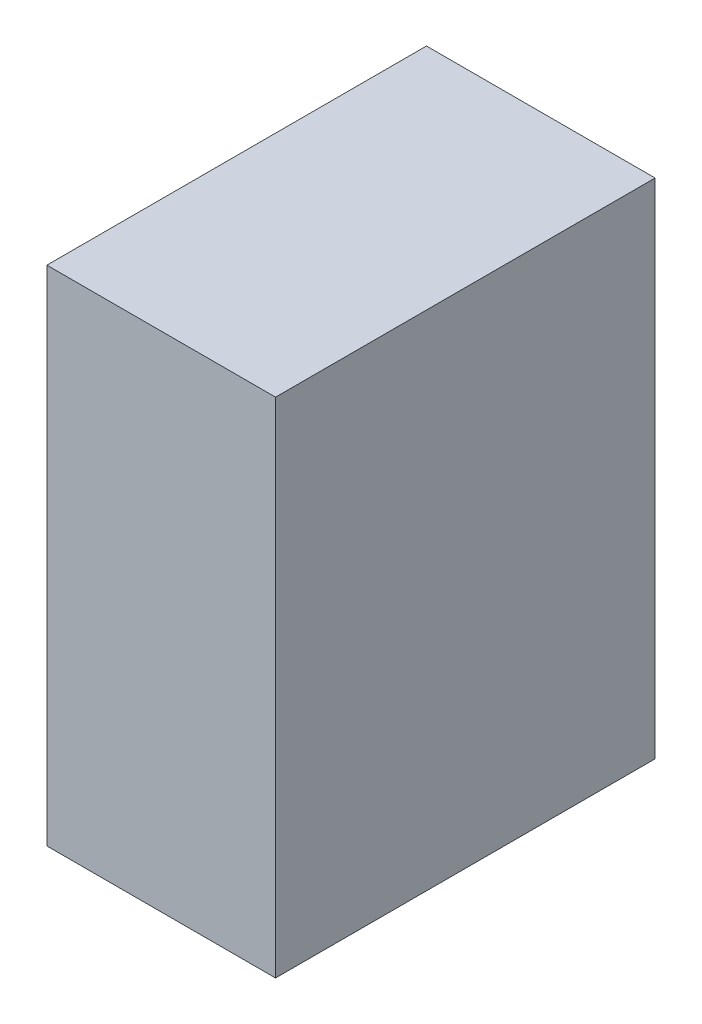
ISO-10303-21;
HEADER;
FILE_DESCRIPTION(('STEP AP214'),'2;1');
FILE_NAME('part.step','',(''),(''),'','','');
FILE_SCHEMA(('AUTOMOTIVE_DESIGN { 1 0 10303 214 1 1 1 1 }'));
ENDSEC;
DATA;
#1=APPLICATION_CONTEXT('core data for automotive mechanical design processes');
#2=APPLICATION_PROTOCOL_DEFINITION('international standard','automotive_design',2000,#1);
#3=PRODUCT_CONTEXT('',#1,'mechanical');
#4=PRODUCT('Part','Part','',(#3));
#5=PRODUCT_RELATED_PRODUCT_CATEGORY('part','',(#4));
#6=PRODUCT_DEFINITION_FORMATION('','',#4);
#7=PRODUCT_DEFINITION_CONTEXT('part definition',#1,'design');
#8=PRODUCT_DEFINITION('design','',#6,#7);
#9=PRODUCT_DEFINITION_SHAPE('','',#8);
#10=(LENGTH_UNIT() NAMED_UNIT(*) SI_UNIT(.MILLI.,.METRE.));
#11=(NAMED_UNIT(*) PLANE_ANGLE_UNIT() SI_UNIT($,.RADIAN.));
#12=(NAMED_UNIT(*) SI_UNIT($,.STERADIAN.) SOLID_ANGLE_UNIT());
#13=UNCERTAINTY_MEASURE_WITH_UNIT(LENGTH_MEASURE(1.E-05),#10,'distance_accuracy_value','');
#14=(GEOMETRIC_REPRESENTATION_CONTEXT(3) GLOBAL_UNCERTAINTY_ASSIGNED_CONTEXT((#13)) GLOBAL_UNIT_ASSIGNED_CONTEXT((#10,
#11,#12)) REPRESENTATION_CONTEXT('',''));
#15=CARTESIAN_POINT('',(0.,0.,0.));
#16=DIRECTION('',(0.,0.,1.));
#17=DIRECTION('',(1.,0.,0.));
#18=AXIS2_PLACEMENT_3D('',#15,#16,#17);
#19=CARTESIAN_POINT('',(-6.35,-12.7,21.082));
#20=DIRECTION('',(1.,0.,0.));
#21=DIRECTION('',(0.,0.,-1.));
#22=AXIS2_PLACEMENT_3D('',#19,#20,#21);
#23=PLANE('',#22);
#24=DIRECTION('',(0.,-1.,0.));
#25=VECTOR('',#24,1.);
#26=CARTESIAN_POINT('',(-6.35,-12.7,0.));
#27=LINE('',#26,#25);
#28=CARTESIAN_POINT('',(-6.35,15.24,0.));
#29=VERTEX_POINT('',#28);
#30=CARTESIAN_POINT('',(-6.35,-12.7,0.));
#31=VERTEX_POINT('',#30);
#32=EDGE_CURVE('E87',#29,#31,#27,.T.);
#33=ORIENTED_EDGE('',*,*,#32,.T.);
#34=DIRECTION('',(0.,0.,-1.));
#35=VECTOR('',#34,1.);
#36=CARTESIAN_POINT('',(-6.35,-12.7,21.082));
#37=LINE('',#36,#35);
#38=CARTESIAN_POINT('',(-6.35,-12.7,21.082));
#39=VERTEX_POINT('',#38);
#40=EDGE_CURVE('E47',#39,#31,#37,.T.);
#41=ORIENTED_EDGE('',*,*,#40,.F.);
#42=DIRECTION('',(0.,-1.,0.));
#43=VECTOR('',#42,1.);
#44=CARTESIAN_POINT('',(-6.35,-12.7,21.082));
#45=LINE('',#44,#43);
#46=CARTESIAN_POINT('',(-6.35,15.24,21.082));
#47=VERTEX_POINT('',#46);
#48=EDGE_CURVE('E105',#47,#39,#45,.T.);
#49=ORIENTED_EDGE('',*,*,#48,.F.);
#50=DIRECTION('',(0.,0.,1.));
#51=VECTOR('',#50,1.);
#52=CARTESIAN_POINT('',(-6.35,15.24,21.082));
#53=LINE('',#52,#51);
#54=EDGE_CURVE('E122',#29,#47,#53,.T.);
#55=ORIENTED_EDGE('',*,*,#54,.F.);
#56=EDGE_LOOP('',(#33,#41,#49,#55));
#57=FACE_BOUND('',#56,.T.);
#58=ADVANCED_FACE('F39',(#57),#23,.F.);
#59=CARTESIAN_POINT('',(6.35,-12.7,21.082));
#60=DIRECTION('',(0.,1.,0.));
#61=DIRECTION('',(-1.,0.,0.));
#62=AXIS2_PLACEMENT_3D('',#59,#60,#61);
#63=PLANE('',#62);
#64=DIRECTION('',(1.,0.,0.));
#65=VECTOR('',#64,1.);
#66=CARTESIAN_POINT('',(6.35,-12.7,0.));
#67=LINE('',#66,#65);
#68=CARTESIAN_POINT('',(-4.064,-12.7,0.));
#69=VERTEX_POINT('',#68);
#70=EDGE_CURVE('E86',#31,#69,#67,.T.);
#71=ORIENTED_EDGE('',*,*,#70,.T.);
#72=DIRECTION('',(0.,0.,1.));
#73=VECTOR('',#72,1.);
#74=CARTESIAN_POINT('',(-4.064,-12.7,21.082));
#75=LINE('',#74,#73);
#76=CARTESIAN_POINT('',(-4.064,-12.7,18.542));
#77=VERTEX_POINT('',#76);
#78=EDGE_CURVE('E137',#69,#77,#75,.T.);
#79=ORIENTED_EDGE('',*,*,#78,.T.);
#80=DIRECTION('',(1.,0.,0.));
#81=VECTOR('',#80,1.);
#82=CARTESIAN_POINT('',(6.35,-12.7,18.542));
#83=LINE('',#82,#81);
#84=CARTESIAN_POINT('',(4.064,-12.7,18.542));
#85=VERTEX_POINT('',#84);
#86=EDGE_CURVE('E127',#77,#85,#83,.T.);
#87=ORIENTED_EDGE('',*,*,#86,.T.);
#88=DIRECTION('',(0.,0.,-1.));
#89=VECTOR('',#88,1.);
#90=CARTESIAN_POINT('',(4.064,-12.7,21.082));
#91=LINE('',#90,#89);
#92=CARTESIAN_POINT('',(4.064,-12.7,5.33400000000001));
#93=VERTEX_POINT('',#92);
#94=EDGE_CURVE('E124',#85,#93,#91,.T.);
#95=ORIENTED_EDGE('',*,*,#94,.T.);
#96=DIRECTION('',(-1.,0.,0.));
#97=VECTOR('',#96,1.);
#98=CARTESIAN_POINT('',(6.35,-12.7,5.33400000000001));
#99=LINE('',#98,#97);
#100=CARTESIAN_POINT('',(1.016,-12.7,5.33400000000001));
#101=VERTEX_POINT('',#100);
#102=EDGE_CURVE('E140',#93,#101,#99,.T.);
#103=ORIENTED_EDGE('',*,*,#102,.T.);
#104=DIRECTION('',(0.,0.,-1.));
#105=VECTOR('',#104,1.);
#106=CARTESIAN_POINT('',(1.016,-12.7,21.082));
#107=LINE('',#106,#105);
#108=CARTESIAN_POINT('',(1.016,-12.7,0.));
#109=VERTEX_POINT('',#108);
#110=EDGE_CURVE('E54',#101,#109,#107,.T.);
#111=ORIENTED_EDGE('',*,*,#110,.T.);
#112=CARTESIAN_POINT('',(6.35,-12.7,0.));
#113=VERTEX_POINT('',#112);
#114=EDGE_CURVE('E74',#109,#113,#67,.T.);
#115=ORIENTED_EDGE('',*,*,#114,.T.);
#116=DIRECTION('',(0.,0.,-1.));
#117=VECTOR('',#116,1.);
#118=CARTESIAN_POINT('',(6.35,-12.7,21.082));
#119=LINE('',#118,#117);
#120=CARTESIAN_POINT('',(6.35,-12.7,21.082));
#121=VERTEX_POINT('',#120);
#122=EDGE_CURVE('E78',#121,#113,#119,.T.);
#123=ORIENTED_EDGE('',*,*,#122,.F.);
#124=DIRECTION('',(1.,0.,0.));
#125=VECTOR('',#124,1.);
#126=CARTESIAN_POINT('',(6.35,-12.7,21.082));
#127=LINE('',#126,#125);
#128=EDGE_CURVE('E62',#39,#121,#127,.T.);
#129=ORIENTED_EDGE('',*,*,#128,.F.);
#130=ORIENTED_EDGE('',*,*,#40,.T.);
#131=EDGE_LOOP('',(#71,#79,#87,#95,#103,#111,#115,#123,#129,#130));
#132=FACE_BOUND('',#131,.T.);
#133=ADVANCED_FACE('F77',(#132),#63,.F.);
#134=CARTESIAN_POINT('',(6.35,-12.7,21.082));
#135=DIRECTION('',(-1.,0.,0.));
#136=DIRECTION('',(0.,0.,1.));
#137=AXIS2_PLACEMENT_3D('',#134,#135,#136);
#138=PLANE('',#137);
#139=DIRECTION('',(0.,1.,0.));
#140=VECTOR('',#139,1.);
#141=CARTESIAN_POINT('',(6.35,-12.7,0.));
#142=LINE('',#141,#140);
#143=CARTESIAN_POINT('',(6.35,15.24,0.));
#144=VERTEX_POINT('',#143);
#145=EDGE_CURVE('E94',#113,#144,#142,.T.);
#146=ORIENTED_EDGE('',*,*,#145,.T.);
#147=DIRECTION('',(0.,0.,-1.));
#148=VECTOR('',#147,1.);
#149=CARTESIAN_POINT('',(6.35,15.24,21.082));
#150=LINE('',#149,#148);
#151=CARTESIAN_POINT('',(6.35,15.24,21.082));
#152=VERTEX_POINT('',#151);
#153=EDGE_CURVE('E189',#152,#144,#150,.T.);
#154=ORIENTED_EDGE('',*,*,#153,.F.);
#155=DIRECTION('',(0.,1.,0.));
#156=VECTOR('',#155,1.);
#157=CARTESIAN_POINT('',(6.35,-12.7,21.082));
#158=LINE('',#157,#156);
#159=EDGE_CURVE('E96',#121,#152,#158,.T.);
#160=ORIENTED_EDGE('',*,*,#159,.F.);
#161=ORIENTED_EDGE('',*,*,#122,.T.);
#162=EDGE_LOOP('',(#146,#154,#160,#161));
#163=FACE_BOUND('',#162,.T.);
#164=ADVANCED_FACE('F91',(#163),#138,.F.);
#165=CARTESIAN_POINT('',(0.,0.,21.082));
#166=DIRECTION('',(0.,0.,1.));
#167=DIRECTION('',(1.,0.,0.));
#168=AXIS2_PLACEMENT_3D('',#165,#166,#167);
#169=PLANE('',#168);
#170=ORIENTED_EDGE('',*,*,#48,.T.);
#171=ORIENTED_EDGE('',*,*,#128,.T.);
#172=ORIENTED_EDGE('',*,*,#159,.T.);
#173=DIRECTION('',(1.,0.,0.));
#174=VECTOR('',#173,1.);
#175=CARTESIAN_POINT('',(6.35,15.24,21.082));
#176=LINE('',#175,#174);
#177=EDGE_CURVE('E184',#47,#152,#176,.T.);
#178=ORIENTED_EDGE('',*,*,#177,.F.);
#179=EDGE_LOOP('',(#170,#171,#172,#178));
#180=FACE_BOUND('',#179,.T.);
#181=ADVANCED_FACE('F266',(#180),#169,.T.);
#182=CARTESIAN_POINT('',(0.,0.,0.));
#183=DIRECTION('',(0.,0.,1.));
#184=DIRECTION('',(1.,0.,0.));
#185=AXIS2_PLACEMENT_3D('',#182,#183,#184);
#186=PLANE('',#185);
#187=ORIENTED_EDGE('',*,*,#114,.F.);
#188=DIRECTION('',(0.,1.,0.));
#189=VECTOR('',#188,1.);
#190=CARTESIAN_POINT('',(1.01600000000001,-15.24,0.));
#191=LINE('',#190,#189);
#192=CARTESIAN_POINT('',(1.016,12.7,0.));
#193=VERTEX_POINT('',#192);
#194=EDGE_CURVE('E174',#109,#193,#191,.T.);
#195=ORIENTED_EDGE('',*,*,#194,.T.);
#196=DIRECTION('',(-1.,0.,0.));
#197=VECTOR('',#196,1.);
#198=CARTESIAN_POINT('',(6.35,12.7,0.));
#199=LINE('',#198,#197);
#200=CARTESIAN_POINT('',(-4.064,12.7,0.));
#201=VERTEX_POINT('',#200);
#202=EDGE_CURVE('E185',#193,#201,#199,.T.);
#203=ORIENTED_EDGE('',*,*,#202,.T.);
#204=DIRECTION('',(0.,1.,0.));
#205=VECTOR('',#204,1.);
#206=CARTESIAN_POINT('',(-4.064,-15.24,0.));
#207=LINE('',#206,#205);
#208=EDGE_CURVE('E173',#69,#201,#207,.T.);
#209=ORIENTED_EDGE('',*,*,#208,.F.);
#210=ORIENTED_EDGE('',*,*,#70,.F.);
#211=ORIENTED_EDGE('',*,*,#32,.F.);
#212=DIRECTION('',(-1.,0.,0.));
#213=VECTOR('',#212,1.);
#214=CARTESIAN_POINT('',(6.35,15.24,0.));
#215=LINE('',#214,#213);
#216=EDGE_CURVE('E102',#144,#29,#215,.T.);
#217=ORIENTED_EDGE('',*,*,#216,.F.);
#218=ORIENTED_EDGE('',*,*,#145,.F.);
#219=EDGE_LOOP('',(#187,#195,#203,#209,#210,#211,#217,#218));
#220=FACE_BOUND('',#219,.T.);
#221=ADVANCED_FACE('F99',(#220),#186,.F.);
#222=CARTESIAN_POINT('',(4.064,-15.24,18.542));
#223=DIRECTION('',(1.,0.,0.));
#224=DIRECTION('',(0.,1.,0.));
#225=AXIS2_PLACEMENT_3D('',#222,#223,#224);
#226=PLANE('',#225);
#227=DIRECTION('',(0.,1.,0.));
#228=VECTOR('',#227,1.);
#229=CARTESIAN_POINT('',(4.064,-15.24,18.542));
#230=LINE('',#229,#228);
#231=CARTESIAN_POINT('',(4.064,12.7,18.542));
#232=VERTEX_POINT('',#231);
#233=EDGE_CURVE('E143',#85,#232,#230,.T.);
#234=ORIENTED_EDGE('',*,*,#233,.T.);
#235=DIRECTION('',(0.,0.,-1.));
#236=VECTOR('',#235,1.);
#237=CARTESIAN_POINT('',(4.064,12.7,18.542));
#238=LINE('',#237,#236);
#239=CARTESIAN_POINT('',(4.064,12.7,5.33400000000001));
#240=VERTEX_POINT('',#239);
#241=EDGE_CURVE('E167',#232,#240,#238,.T.);
#242=ORIENTED_EDGE('',*,*,#241,.T.);
#243=DIRECTION('',(0.,1.,0.));
#244=VECTOR('',#243,1.);
#245=CARTESIAN_POINT('',(4.064,-15.24,5.33400000000001));
#246=LINE('',#245,#244);
#247=EDGE_CURVE('E144',#93,#240,#246,.T.);
#248=ORIENTED_EDGE('',*,*,#247,.F.);
#249=ORIENTED_EDGE('',*,*,#94,.F.);
#250=EDGE_LOOP('',(#234,#242,#248,#249));
#251=FACE_BOUND('',#250,.T.);
#252=ADVANCED_FACE('F238',(#251),#226,.F.);
#253=CARTESIAN_POINT('',(4.064,-15.24,18.542));
#254=DIRECTION('',(0.,0.,1.));
#255=DIRECTION('',(1.,0.,0.));
#256=AXIS2_PLACEMENT_3D('',#253,#254,#255);
#257=PLANE('',#256);
#258=DIRECTION('',(0.,1.,0.));
#259=VECTOR('',#258,1.);
#260=CARTESIAN_POINT('',(-4.064,-15.24,18.542));
#261=LINE('',#260,#259);
#262=CARTESIAN_POINT('',(-4.064,12.7,18.542));
#263=VERTEX_POINT('',#262);
#264=EDGE_CURVE('E148',#77,#263,#261,.T.);
#265=ORIENTED_EDGE('',*,*,#264,.T.);
#266=DIRECTION('',(1.,0.,0.));
#267=VECTOR('',#266,1.);
#268=CARTESIAN_POINT('',(4.064,12.7,18.542));
#269=LINE('',#268,#267);
#270=EDGE_CURVE('E149',#263,#232,#269,.T.);
#271=ORIENTED_EDGE('',*,*,#270,.T.);
#272=ORIENTED_EDGE('',*,*,#233,.F.);
#273=ORIENTED_EDGE('',*,*,#86,.F.);
#274=EDGE_LOOP('',(#265,#271,#272,#273));
#275=FACE_BOUND('',#274,.T.);
#276=ADVANCED_FACE('F240',(#275),#257,.F.);
#277=CARTESIAN_POINT('',(-4.064,-15.24,18.542));
#278=DIRECTION('',(-1.,0.,0.));
#279=DIRECTION('',(0.,-1.,0.));
#280=AXIS2_PLACEMENT_3D('',#277,#278,#279);
#281=PLANE('',#280);
#282=ORIENTED_EDGE('',*,*,#78,.F.);
#283=ORIENTED_EDGE('',*,*,#208,.T.);
#284=DIRECTION('',(0.,0.,1.));
#285=VECTOR('',#284,1.);
#286=CARTESIAN_POINT('',(-4.064,12.7,18.542));
#287=LINE('',#286,#285);
#288=EDGE_CURVE('E159',#201,#263,#287,.T.);
#289=ORIENTED_EDGE('',*,*,#288,.T.);
#290=ORIENTED_EDGE('',*,*,#264,.F.);
#291=EDGE_LOOP('',(#282,#283,#289,#290));
#292=FACE_BOUND('',#291,.T.);
#293=ADVANCED_FACE('F244',(#292),#281,.F.);
#294=CARTESIAN_POINT('',(4.064,-15.24,5.33400000000001));
#295=DIRECTION('',(0.,0.,-1.));
#296=DIRECTION('',(-1.,0.,0.));
#297=AXIS2_PLACEMENT_3D('',#294,#295,#296);
#298=PLANE('',#297);
#299=DIRECTION('',(-1.,0.,0.));
#300=VECTOR('',#299,1.);
#301=CARTESIAN_POINT('',(4.064,12.7,5.33400000000001));
#302=LINE('',#301,#300);
#303=CARTESIAN_POINT('',(1.016,12.7,5.33400000000001));
#304=VERTEX_POINT('',#303);
#305=EDGE_CURVE('E163',#240,#304,#302,.T.);
#306=ORIENTED_EDGE('',*,*,#305,.T.);
#307=DIRECTION('',(0.,-1.,0.));
#308=VECTOR('',#307,1.);
#309=CARTESIAN_POINT('',(1.01600000000001,-15.24,5.33400000000001));
#310=LINE('',#309,#308);
#311=EDGE_CURVE('E11',#304,#101,#310,.T.);
#312=ORIENTED_EDGE('',*,*,#311,.T.);
#313=ORIENTED_EDGE('',*,*,#102,.F.);
#314=ORIENTED_EDGE('',*,*,#247,.T.);
#315=EDGE_LOOP('',(#306,#312,#313,#314));
#316=FACE_BOUND('',#315,.T.);
#317=ADVANCED_FACE('F249',(#316),#298,.F.);
#318=CARTESIAN_POINT('',(1.01600000000001,-15.24,5.33400000000001));
#319=DIRECTION('',(1.,0.,0.));
#320=DIRECTION('',(0.,1.,0.));
#321=AXIS2_PLACEMENT_3D('',#318,#319,#320);
#322=PLANE('',#321);
#323=ORIENTED_EDGE('',*,*,#311,.F.);
#324=DIRECTION('',(0.,0.,-1.));
#325=VECTOR('',#324,1.);
#326=CARTESIAN_POINT('',(1.016,12.7,5.33400000000001));
#327=LINE('',#326,#325);
#328=EDGE_CURVE('E177',#304,#193,#327,.T.);
#329=ORIENTED_EDGE('',*,*,#328,.T.);
#330=ORIENTED_EDGE('',*,*,#194,.F.);
#331=ORIENTED_EDGE('',*,*,#110,.F.);
#332=EDGE_LOOP('',(#323,#329,#330,#331));
#333=FACE_BOUND('',#332,.T.);
#334=ADVANCED_FACE('F247',(#333),#322,.F.);
#335=CARTESIAN_POINT('',(0.,15.24,0.));
#336=DIRECTION('',(0.,1.,0.));
#337=DIRECTION('',(-1.,0.,0.));
#338=AXIS2_PLACEMENT_3D('',#335,#336,#337);
#339=PLANE('',#338);
#340=ORIENTED_EDGE('',*,*,#153,.T.);
#341=ORIENTED_EDGE('',*,*,#216,.T.);
#342=ORIENTED_EDGE('',*,*,#54,.T.);
#343=ORIENTED_EDGE('',*,*,#177,.T.);
#344=EDGE_LOOP('',(#340,#341,#342,#343));
#345=FACE_BOUND('',#344,.T.);
#346=ADVANCED_FACE('F199',(#345),#339,.T.);
#347=CARTESIAN_POINT('',(0.,12.7,0.));
#348=DIRECTION('',(0.,1.,0.));
#349=DIRECTION('',(-1.,0.,0.));
#350=AXIS2_PLACEMENT_3D('',#347,#348,#349);
#351=PLANE('',#350);
#352=ORIENTED_EDGE('',*,*,#288,.F.);
#353=ORIENTED_EDGE('',*,*,#202,.F.);
#354=ORIENTED_EDGE('',*,*,#328,.F.);
#355=ORIENTED_EDGE('',*,*,#305,.F.);
#356=ORIENTED_EDGE('',*,*,#241,.F.);
#357=ORIENTED_EDGE('',*,*,#270,.F.);
#358=EDGE_LOOP('',(#352,#353,#354,#355,#356,#357));
#359=FACE_BOUND('',#358,.T.);
#360=ADVANCED_FACE('F246',(#359),#351,.F.);
#361=CLOSED_SHELL('',(#58,#133,#164,#181,#221,#252,#276,#293,#317,#334,#346,#360));
#362=MANIFOLD_SOLID_BREP('B2',#361);
#363=ADVANCED_BREP_SHAPE_REPRESENTATION('',(#18,#362),#14);
#364=SHAPE_DEFINITION_REPRESENTATION(#9,#363);
ENDSEC;
END-ISO-10303-21;
